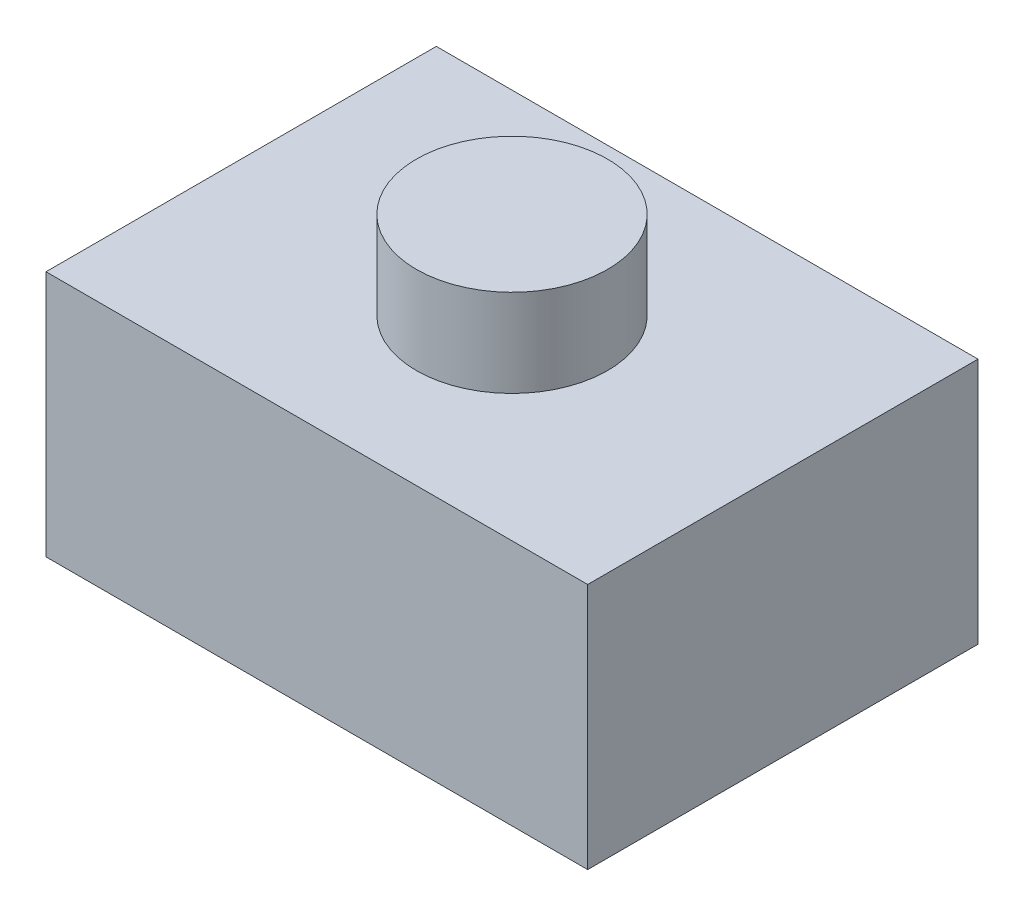
ISO-10303-21;
HEADER;
FILE_DESCRIPTION(('STEP AP214'),'2;1');
FILE_NAME('part.step','',(''),(''),'','','');
FILE_SCHEMA(('AUTOMOTIVE_DESIGN { 1 0 10303 214 1 1 1 1 }'));
ENDSEC;
DATA;
#1=APPLICATION_CONTEXT('core data for automotive mechanical design processes');
#2=APPLICATION_PROTOCOL_DEFINITION('international standard','automotive_design',2000,#1);
#3=PRODUCT_CONTEXT('',#1,'mechanical');
#4=PRODUCT('Part','Part','',(#3));
#5=PRODUCT_RELATED_PRODUCT_CATEGORY('part','',(#4));
#6=PRODUCT_DEFINITION_FORMATION('','',#4);
#7=PRODUCT_DEFINITION_CONTEXT('part definition',#1,'design');
#8=PRODUCT_DEFINITION('design','',#6,#7);
#9=PRODUCT_DEFINITION_SHAPE('','',#8);
#10=(LENGTH_UNIT() NAMED_UNIT(*) SI_UNIT(.MILLI.,.METRE.));
#11=(NAMED_UNIT(*) PLANE_ANGLE_UNIT() SI_UNIT($,.RADIAN.));
#12=(NAMED_UNIT(*) SI_UNIT($,.STERADIAN.) SOLID_ANGLE_UNIT());
#13=UNCERTAINTY_MEASURE_WITH_UNIT(LENGTH_MEASURE(1.E-05),#10,'distance_accuracy_value','');
#14=(GEOMETRIC_REPRESENTATION_CONTEXT(3) GLOBAL_UNCERTAINTY_ASSIGNED_CONTEXT((#13)) GLOBAL_UNIT_ASSIGNED_CONTEXT((#10,
#11,#12)) REPRESENTATION_CONTEXT('',''));
#15=CARTESIAN_POINT('',(0.,0.,0.));
#16=DIRECTION('',(0.,0.,1.));
#17=DIRECTION('',(1.,0.,0.));
#18=AXIS2_PLACEMENT_3D('',#15,#16,#17);
#19=CARTESIAN_POINT('',(0.,15.5,0.));
#20=DIRECTION('',(-1.,0.,0.));
#21=DIRECTION('',(0.,0.,1.));
#22=AXIS2_PLACEMENT_3D('',#19,#20,#21);
#23=PLANE('',#22);
#24=DIRECTION('',(0.,0.,-1.));
#25=VECTOR('',#24,1.);
#26=CARTESIAN_POINT('',(0.,0.,0.));
#27=LINE('',#26,#25);
#28=CARTESIAN_POINT('',(0.,0.,0.));
#29=VERTEX_POINT('',#28);
#30=CARTESIAN_POINT('',(0.,0.,-24.5));
#31=VERTEX_POINT('',#30);
#32=EDGE_CURVE('E101',#29,#31,#27,.T.);
#33=ORIENTED_EDGE('',*,*,#32,.T.);
#34=DIRECTION('',(0.,-1.,0.));
#35=VECTOR('',#34,1.);
#36=CARTESIAN_POINT('',(0.,15.5,-24.5));
#37=LINE('',#36,#35);
#38=CARTESIAN_POINT('',(0.,15.5,-24.5));
#39=VERTEX_POINT('',#38);
#40=EDGE_CURVE('E38',#39,#31,#37,.T.);
#41=ORIENTED_EDGE('',*,*,#40,.F.);
#42=DIRECTION('',(0.,0.,-1.));
#43=VECTOR('',#42,1.);
#44=CARTESIAN_POINT('',(0.,15.5,0.));
#45=LINE('',#44,#43);
#46=CARTESIAN_POINT('',(0.,15.5,0.));
#47=VERTEX_POINT('',#46);
#48=EDGE_CURVE('E88',#47,#39,#45,.T.);
#49=ORIENTED_EDGE('',*,*,#48,.F.);
#50=DIRECTION('',(0.,-1.,0.));
#51=VECTOR('',#50,1.);
#52=CARTESIAN_POINT('',(0.,15.5,0.));
#53=LINE('',#52,#51);
#54=EDGE_CURVE('E97',#47,#29,#53,.T.);
#55=ORIENTED_EDGE('',*,*,#54,.T.);
#56=EDGE_LOOP('',(#33,#41,#49,#55));
#57=FACE_BOUND('',#56,.T.);
#58=ADVANCED_FACE('F35',(#57),#23,.F.);
#59=CARTESIAN_POINT('',(0.,15.5,-24.5));
#60=DIRECTION('',(0.,0.,1.));
#61=DIRECTION('',(1.,0.,0.));
#62=AXIS2_PLACEMENT_3D('',#59,#60,#61);
#63=PLANE('',#62);
#64=DIRECTION('',(-1.,0.,0.));
#65=VECTOR('',#64,1.);
#66=CARTESIAN_POINT('',(0.,0.,-24.5));
#67=LINE('',#66,#65);
#68=CARTESIAN_POINT('',(-34.,0.,-24.5));
#69=VERTEX_POINT('',#68);
#70=EDGE_CURVE('E93',#31,#69,#67,.T.);
#71=ORIENTED_EDGE('',*,*,#70,.T.);
#72=DIRECTION('',(0.,-1.,0.));
#73=VECTOR('',#72,1.);
#74=CARTESIAN_POINT('',(-34.,15.5,-24.5));
#75=LINE('',#74,#73);
#76=CARTESIAN_POINT('',(-34.,15.5,-24.5));
#77=VERTEX_POINT('',#76);
#78=EDGE_CURVE('E91',#77,#69,#75,.T.);
#79=ORIENTED_EDGE('',*,*,#78,.F.);
#80=DIRECTION('',(-1.,0.,0.));
#81=VECTOR('',#80,1.);
#82=CARTESIAN_POINT('',(0.,15.5,-24.5));
#83=LINE('',#82,#81);
#84=EDGE_CURVE('E83',#39,#77,#83,.T.);
#85=ORIENTED_EDGE('',*,*,#84,.F.);
#86=ORIENTED_EDGE('',*,*,#40,.T.);
#87=EDGE_LOOP('',(#71,#79,#85,#86));
#88=FACE_BOUND('',#87,.T.);
#89=ADVANCED_FACE('F92',(#88),#63,.F.);
#90=CARTESIAN_POINT('',(-34.,15.5,0.));
#91=DIRECTION('',(1.,0.,0.));
#92=DIRECTION('',(0.,0.,-1.));
#93=AXIS2_PLACEMENT_3D('',#90,#91,#92);
#94=PLANE('',#93);
#95=DIRECTION('',(0.,0.,1.));
#96=VECTOR('',#95,1.);
#97=CARTESIAN_POINT('',(-34.,0.,0.));
#98=LINE('',#97,#96);
#99=CARTESIAN_POINT('',(-34.,0.,0.));
#100=VERTEX_POINT('',#99);
#101=EDGE_CURVE('E69',#69,#100,#98,.T.);
#102=ORIENTED_EDGE('',*,*,#101,.T.);
#103=DIRECTION('',(0.,-1.,0.));
#104=VECTOR('',#103,1.);
#105=CARTESIAN_POINT('',(-34.,15.5,0.));
#106=LINE('',#105,#104);
#107=CARTESIAN_POINT('',(-34.,15.5,0.));
#108=VERTEX_POINT('',#107);
#109=EDGE_CURVE('E94',#108,#100,#106,.T.);
#110=ORIENTED_EDGE('',*,*,#109,.F.);
#111=DIRECTION('',(0.,0.,1.));
#112=VECTOR('',#111,1.);
#113=CARTESIAN_POINT('',(-34.,15.5,0.));
#114=LINE('',#113,#112);
#115=EDGE_CURVE('E86',#77,#108,#114,.T.);
#116=ORIENTED_EDGE('',*,*,#115,.F.);
#117=ORIENTED_EDGE('',*,*,#78,.T.);
#118=EDGE_LOOP('',(#102,#110,#116,#117));
#119=FACE_BOUND('',#118,.T.);
#120=ADVANCED_FACE('F95',(#119),#94,.F.);
#121=CARTESIAN_POINT('',(0.,15.5,0.));
#122=DIRECTION('',(0.,0.,-1.));
#123=DIRECTION('',(-1.,0.,0.));
#124=AXIS2_PLACEMENT_3D('',#121,#122,#123);
#125=PLANE('',#124);
#126=DIRECTION('',(1.,0.,0.));
#127=VECTOR('',#126,1.);
#128=CARTESIAN_POINT('',(0.,0.,0.));
#129=LINE('',#128,#127);
#130=EDGE_CURVE('E75',#100,#29,#129,.T.);
#131=ORIENTED_EDGE('',*,*,#130,.T.);
#132=ORIENTED_EDGE('',*,*,#54,.F.);
#133=DIRECTION('',(1.,0.,0.));
#134=VECTOR('',#133,1.);
#135=CARTESIAN_POINT('',(0.,15.5,0.));
#136=LINE('',#135,#134);
#137=EDGE_CURVE('E52',#108,#47,#136,.T.);
#138=ORIENTED_EDGE('',*,*,#137,.F.);
#139=ORIENTED_EDGE('',*,*,#109,.T.);
#140=EDGE_LOOP('',(#131,#132,#138,#139));
#141=FACE_BOUND('',#140,.T.);
#142=ADVANCED_FACE('F109',(#141),#125,.F.);
#143=CARTESIAN_POINT('',(0.,15.5,0.));
#144=DIRECTION('',(0.,1.,0.));
#145=DIRECTION('',(0.,0.,1.));
#146=AXIS2_PLACEMENT_3D('',#143,#144,#145);
#147=PLANE('',#146);
#148=CARTESIAN_POINT('',(-17.,15.5,-12.25));
#149=DIRECTION('',(0.,1.,0.));
#150=DIRECTION('',(0.,0.,1.));
#151=AXIS2_PLACEMENT_3D('',#148,#149,#150);
#152=CIRCLE('',#151,6.);
#153=CARTESIAN_POINT('',(-17.,15.5,-6.25));
#154=VERTEX_POINT('',#153);
#155=EDGE_CURVE('E11',#154,#154,#152,.T.);
#156=ORIENTED_EDGE('',*,*,#155,.F.);
#157=EDGE_LOOP('',(#156));
#158=FACE_BOUND('',#157,.T.);
#159=ORIENTED_EDGE('',*,*,#48,.T.);
#160=ORIENTED_EDGE('',*,*,#84,.T.);
#161=ORIENTED_EDGE('',*,*,#115,.T.);
#162=ORIENTED_EDGE('',*,*,#137,.T.);
#163=EDGE_LOOP('',(#159,#160,#161,#162));
#164=FACE_BOUND('',#163,.T.);
#165=ADVANCED_FACE('F84',(#158,#164),#147,.T.);
#166=CARTESIAN_POINT('',(0.,0.,0.));
#167=DIRECTION('',(0.,1.,0.));
#168=DIRECTION('',(0.,0.,1.));
#169=AXIS2_PLACEMENT_3D('',#166,#167,#168);
#170=PLANE('',#169);
#171=ORIENTED_EDGE('',*,*,#32,.F.);
#172=ORIENTED_EDGE('',*,*,#130,.F.);
#173=ORIENTED_EDGE('',*,*,#101,.F.);
#174=ORIENTED_EDGE('',*,*,#70,.F.);
#175=EDGE_LOOP('',(#171,#172,#173,#174));
#176=FACE_BOUND('',#175,.T.);
#177=ADVANCED_FACE('F112',(#176),#170,.F.);
#178=CARTESIAN_POINT('',(-17.,21.,-12.25));
#179=DIRECTION('',(0.,-1.,0.));
#180=DIRECTION('',(0.,0.,-1.));
#181=AXIS2_PLACEMENT_3D('',#178,#179,#180);
#182=CYLINDRICAL_SURFACE('',#181,6.);
#183=CARTESIAN_POINT('',(-17.,21.,-12.25));
#184=DIRECTION('',(0.,1.,0.));
#185=DIRECTION('',(0.,0.,1.));
#186=AXIS2_PLACEMENT_3D('',#183,#184,#185);
#187=CIRCLE('',#186,6.);
#188=CARTESIAN_POINT('',(-17.,21.,-6.25));
#189=VERTEX_POINT('',#188);
#190=EDGE_CURVE('E104',#189,#189,#187,.T.);
#191=ORIENTED_EDGE('',*,*,#190,.F.);
#192=EDGE_LOOP('',(#191));
#193=FACE_BOUND('',#192,.T.);
#194=ORIENTED_EDGE('',*,*,#155,.T.);
#195=EDGE_LOOP('',(#194));
#196=FACE_BOUND('',#195,.T.);
#197=ADVANCED_FACE('F120',(#193,#196),#182,.T.);
#198=CARTESIAN_POINT('',(-17.,21.,-12.25));
#199=DIRECTION('',(0.,1.,0.));
#200=DIRECTION('',(0.,0.,1.));
#201=AXIS2_PLACEMENT_3D('',#198,#199,#200);
#202=PLANE('',#201);
#203=ORIENTED_EDGE('',*,*,#190,.T.);
#204=EDGE_LOOP('',(#203));
#205=FACE_BOUND('',#204,.T.);
#206=ADVANCED_FACE('F118',(#205),#202,.T.);
#207=CLOSED_SHELL('',(#58,#89,#120,#142,#165,#177,#197,#206));
#208=MANIFOLD_SOLID_BREP('B2',#207);
#209=ADVANCED_BREP_SHAPE_REPRESENTATION('',(#18,#208),#14);
#210=SHAPE_DEFINITION_REPRESENTATION(#9,#209);
ENDSEC;
END-ISO-10303-21;
